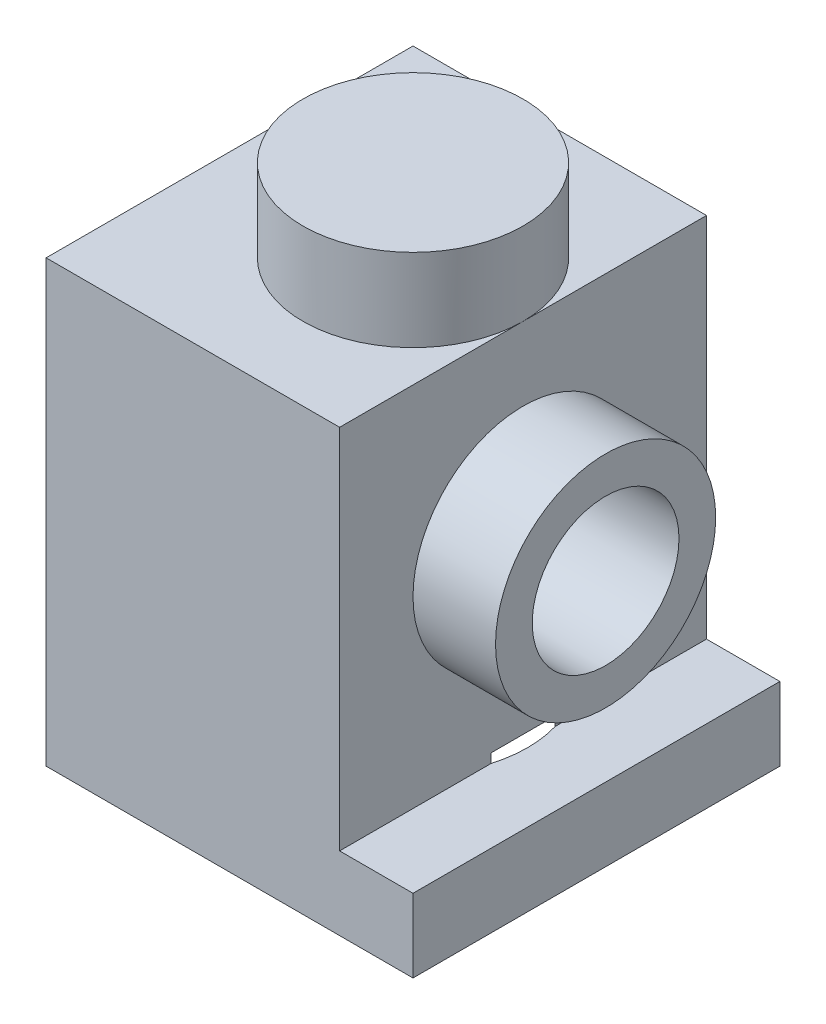
ISO-10303-21;
HEADER;
FILE_DESCRIPTION(('STEP AP214'),'2;1');
FILE_NAME('part.step','',(''),(''),'','','');
FILE_SCHEMA(('AUTOMOTIVE_DESIGN { 1 0 10303 214 1 1 1 1 }'));
ENDSEC;
DATA;
#1=APPLICATION_CONTEXT('core data for automotive mechanical design processes');
#2=APPLICATION_PROTOCOL_DEFINITION('international standard','automotive_design',2000,#1);
#3=PRODUCT_CONTEXT('',#1,'mechanical');
#4=PRODUCT('Part','Part','',(#3));
#5=PRODUCT_RELATED_PRODUCT_CATEGORY('part','',(#4));
#6=PRODUCT_DEFINITION_FORMATION('','',#4);
#7=PRODUCT_DEFINITION_CONTEXT('part definition',#1,'design');
#8=PRODUCT_DEFINITION('design','',#6,#7);
#9=PRODUCT_DEFINITION_SHAPE('','',#8);
#10=(LENGTH_UNIT() NAMED_UNIT(*) SI_UNIT(.MILLI.,.METRE.));
#11=(NAMED_UNIT(*) PLANE_ANGLE_UNIT() SI_UNIT($,.RADIAN.));
#12=(NAMED_UNIT(*) SI_UNIT($,.STERADIAN.) SOLID_ANGLE_UNIT());
#13=UNCERTAINTY_MEASURE_WITH_UNIT(LENGTH_MEASURE(1.E-05),#10,'distance_accuracy_value','');
#14=(GEOMETRIC_REPRESENTATION_CONTEXT(3) GLOBAL_UNCERTAINTY_ASSIGNED_CONTEXT((#13)) GLOBAL_UNIT_ASSIGNED_CONTEXT((#10,
#11,#12)) REPRESENTATION_CONTEXT('',''));
#15=CARTESIAN_POINT('',(0.,0.,0.));
#16=DIRECTION('',(0.,0.,1.));
#17=DIRECTION('',(1.,0.,0.));
#18=AXIS2_PLACEMENT_3D('',#15,#16,#17);
#19=CARTESIAN_POINT('',(-4.8,5.6,0.));
#20=DIRECTION('',(1.,0.,0.));
#21=DIRECTION('',(0.,0.,-1.));
#22=AXIS2_PLACEMENT_3D('',#19,#20,#21);
#23=CYLINDRICAL_SURFACE('',#22,1.6);
#24=CARTESIAN_POINT('',(4.2,5.6,0.));
#25=DIRECTION('',(1.,0.,0.));
#26=DIRECTION('',(0.,0.,-1.));
#27=AXIS2_PLACEMENT_3D('',#24,#25,#26);
#28=CIRCLE('',#27,1.6);
#29=CARTESIAN_POINT('',(4.2,5.6,-1.60000000000009));
#30=VERTEX_POINT('',#29);
#31=EDGE_CURVE('E176',#30,#30,#28,.T.);
#32=ORIENTED_EDGE('',*,*,#31,.T.);
#33=EDGE_LOOP('',(#32));
#34=FACE_BOUND('',#33,.T.);
#35=CARTESIAN_POINT('',(1.,5.6,0.));
#36=DIRECTION('',(-1.,0.,0.));
#37=DIRECTION('',(0.,0.,1.));
#38=AXIS2_PLACEMENT_3D('',#35,#36,#37);
#39=CIRCLE('',#38,1.6);
#40=CARTESIAN_POINT('',(1.,5.6,1.5999999999999));
#41=VERTEX_POINT('',#40);
#42=EDGE_CURVE('E167',#41,#41,#39,.F.);
#43=ORIENTED_EDGE('',*,*,#42,.F.);
#44=EDGE_LOOP('',(#43));
#45=FACE_BOUND('',#44,.T.);
#46=ADVANCED_FACE('F33',(#34,#45),#23,.F.);
#47=CARTESIAN_POINT('',(4.,9.6,4.));
#48=DIRECTION('',(-1.,0.,0.));
#49=DIRECTION('',(0.,0.,1.));
#50=AXIS2_PLACEMENT_3D('',#47,#48,#49);
#51=PLANE('',#50);
#52=DIRECTION('',(0.,0.,-1.));
#53=VECTOR('',#52,1.);
#54=CARTESIAN_POINT('',(4.,1.6,-4.));
#55=LINE('',#54,#53);
#56=CARTESIAN_POINT('',(4.,1.6,4.));
#57=VERTEX_POINT('',#56);
#58=CARTESIAN_POINT('',(4.,1.6,-4.));
#59=VERTEX_POINT('',#58);
#60=EDGE_CURVE('E190',#57,#59,#55,.T.);
#61=ORIENTED_EDGE('',*,*,#60,.F.);
#62=DIRECTION('',(0.,-1.,0.));
#63=VECTOR('',#62,1.);
#64=CARTESIAN_POINT('',(4.,9.6,4.));
#65=LINE('',#64,#63);
#66=CARTESIAN_POINT('',(4.,0.,4.));
#67=VERTEX_POINT('',#66);
#68=EDGE_CURVE('E226',#57,#67,#65,.T.);
#69=ORIENTED_EDGE('',*,*,#68,.T.);
#70=DIRECTION('',(0.,0.,-1.));
#71=VECTOR('',#70,1.);
#72=CARTESIAN_POINT('',(4.,0.,4.));
#73=LINE('',#72,#71);
#74=CARTESIAN_POINT('',(4.,0.,-4.));
#75=VERTEX_POINT('',#74);
#76=EDGE_CURVE('E218',#67,#75,#73,.T.);
#77=ORIENTED_EDGE('',*,*,#76,.T.);
#78=DIRECTION('',(0.,-1.,0.));
#79=VECTOR('',#78,1.);
#80=CARTESIAN_POINT('',(4.,9.6,-4.));
#81=LINE('',#80,#79);
#82=EDGE_CURVE('E224',#59,#75,#81,.T.);
#83=ORIENTED_EDGE('',*,*,#82,.F.);
#84=EDGE_LOOP('',(#61,#69,#77,#83));
#85=FACE_BOUND('',#84,.T.);
#86=ADVANCED_FACE('F240',(#85),#51,.F.);
#87=CARTESIAN_POINT('',(-4.,9.6,4.));
#88=DIRECTION('',(1.,0.,0.));
#89=DIRECTION('',(0.,0.,-1.));
#90=AXIS2_PLACEMENT_3D('',#87,#88,#89);
#91=PLANE('',#90);
#92=DIRECTION('',(0.,0.,1.));
#93=VECTOR('',#92,1.);
#94=CARTESIAN_POINT('',(-4.,3.19828034728268,2.39999999999981));
#95=LINE('',#94,#93);
#96=CARTESIAN_POINT('',(-4.,3.19828034728268,-2.4));
#97=VERTEX_POINT('',#96);
#98=CARTESIAN_POINT('',(-4.,3.19828034728268,2.39999999999981));
#99=VERTEX_POINT('',#98);
#100=EDGE_CURVE('E157',#97,#99,#95,.T.);
#101=ORIENTED_EDGE('',*,*,#100,.F.);
#102=DIRECTION('',(0.,-1.,0.));
#103=VECTOR('',#102,1.);
#104=CARTESIAN_POINT('',(-4.,3.19828034728268,-2.4));
#105=LINE('',#104,#103);
#106=CARTESIAN_POINT('',(-4.,8.00171965271731,-2.4));
#107=VERTEX_POINT('',#106);
#108=EDGE_CURVE('E56',#107,#97,#105,.T.);
#109=ORIENTED_EDGE('',*,*,#108,.F.);
#110=DIRECTION('',(0.,0.,-1.));
#111=VECTOR('',#110,1.);
#112=CARTESIAN_POINT('',(-4.,8.00171965271731,2.39999999999981));
#113=LINE('',#112,#111);
#114=CARTESIAN_POINT('',(-4.,8.00171965271731,2.39999999999981));
#115=VERTEX_POINT('',#114);
#116=EDGE_CURVE('E146',#115,#107,#113,.T.);
#117=ORIENTED_EDGE('',*,*,#116,.F.);
#118=DIRECTION('',(0.,1.,0.));
#119=VECTOR('',#118,1.);
#120=CARTESIAN_POINT('',(-4.,3.19828034728268,2.39999999999981));
#121=LINE('',#120,#119);
#122=EDGE_CURVE('E160',#99,#115,#121,.T.);
#123=ORIENTED_EDGE('',*,*,#122,.F.);
#124=EDGE_LOOP('',(#101,#109,#117,#123));
#125=FACE_BOUND('',#124,.T.);
#126=DIRECTION('',(0.,0.,1.));
#127=VECTOR('',#126,1.);
#128=CARTESIAN_POINT('',(-4.,0.,4.));
#129=LINE('',#128,#127);
#130=CARTESIAN_POINT('',(-4.,0.,-4.));
#131=VERTEX_POINT('',#130);
#132=CARTESIAN_POINT('',(-4.,0.,4.));
#133=VERTEX_POINT('',#132);
#134=EDGE_CURVE('E200',#131,#133,#129,.T.);
#135=ORIENTED_EDGE('',*,*,#134,.T.);
#136=DIRECTION('',(0.,-1.,0.));
#137=VECTOR('',#136,1.);
#138=CARTESIAN_POINT('',(-4.,9.6,4.));
#139=LINE('',#138,#137);
#140=CARTESIAN_POINT('',(-4.,9.6,4.));
#141=VERTEX_POINT('',#140);
#142=EDGE_CURVE('E228',#141,#133,#139,.T.);
#143=ORIENTED_EDGE('',*,*,#142,.F.);
#144=DIRECTION('',(0.,0.,1.));
#145=VECTOR('',#144,1.);
#146=CARTESIAN_POINT('',(-4.,9.6,4.));
#147=LINE('',#146,#145);
#148=CARTESIAN_POINT('',(-4.,9.6,-4.));
#149=VERTEX_POINT('',#148);
#150=EDGE_CURVE('E203',#149,#141,#147,.T.);
#151=ORIENTED_EDGE('',*,*,#150,.F.);
#152=DIRECTION('',(0.,-1.,0.));
#153=VECTOR('',#152,1.);
#154=CARTESIAN_POINT('',(-4.,9.6,-4.));
#155=LINE('',#154,#153);
#156=EDGE_CURVE('E212',#149,#131,#155,.T.);
#157=ORIENTED_EDGE('',*,*,#156,.T.);
#158=EDGE_LOOP('',(#135,#143,#151,#157));
#159=FACE_BOUND('',#158,.T.);
#160=ADVANCED_FACE('F35',(#125,#159),#91,.F.);
#161=CARTESIAN_POINT('',(4.,9.6,4.));
#162=DIRECTION('',(0.,0.,-1.));
#163=DIRECTION('',(-1.,0.,0.));
#164=AXIS2_PLACEMENT_3D('',#161,#162,#163);
#165=PLANE('',#164);
#166=DIRECTION('',(1.,0.,0.));
#167=VECTOR('',#166,1.);
#168=CARTESIAN_POINT('',(2.4,1.6,4.));
#169=LINE('',#168,#167);
#170=CARTESIAN_POINT('',(2.4,1.6,4.));
#171=VERTEX_POINT('',#170);
#172=EDGE_CURVE('E188',#171,#57,#169,.T.);
#173=ORIENTED_EDGE('',*,*,#172,.F.);
#174=DIRECTION('',(0.,1.,0.));
#175=VECTOR('',#174,1.);
#176=CARTESIAN_POINT('',(2.4,1.6,4.));
#177=LINE('',#176,#175);
#178=CARTESIAN_POINT('',(2.4,9.6,4.));
#179=VERTEX_POINT('',#178);
#180=EDGE_CURVE('E195',#171,#179,#177,.T.);
#181=ORIENTED_EDGE('',*,*,#180,.T.);
#182=DIRECTION('',(1.,0.,0.));
#183=VECTOR('',#182,1.);
#184=CARTESIAN_POINT('',(4.,9.6,4.));
#185=LINE('',#184,#183);
#186=EDGE_CURVE('E206',#141,#179,#185,.T.);
#187=ORIENTED_EDGE('',*,*,#186,.F.);
#188=ORIENTED_EDGE('',*,*,#142,.T.);
#189=DIRECTION('',(1.,0.,0.));
#190=VECTOR('',#189,1.);
#191=CARTESIAN_POINT('',(4.,0.,4.));
#192=LINE('',#191,#190);
#193=EDGE_CURVE('E215',#133,#67,#192,.T.);
#194=ORIENTED_EDGE('',*,*,#193,.T.);
#195=ORIENTED_EDGE('',*,*,#68,.F.);
#196=EDGE_LOOP('',(#173,#181,#187,#188,#194,#195));
#197=FACE_BOUND('',#196,.T.);
#198=ADVANCED_FACE('F277',(#197),#165,.F.);
#199=CARTESIAN_POINT('',(4.,9.6,-4.));
#200=DIRECTION('',(0.,0.,1.));
#201=DIRECTION('',(1.,0.,0.));
#202=AXIS2_PLACEMENT_3D('',#199,#200,#201);
#203=PLANE('',#202);
#204=DIRECTION('',(-1.,0.,0.));
#205=VECTOR('',#204,1.);
#206=CARTESIAN_POINT('',(4.,9.6,-4.));
#207=LINE('',#206,#205);
#208=CARTESIAN_POINT('',(2.4,9.6,-4.));
#209=VERTEX_POINT('',#208);
#210=EDGE_CURVE('E210',#209,#149,#207,.T.);
#211=ORIENTED_EDGE('',*,*,#210,.F.);
#212=DIRECTION('',(0.,1.,0.));
#213=VECTOR('',#212,1.);
#214=CARTESIAN_POINT('',(2.4,1.6,-4.));
#215=LINE('',#214,#213);
#216=CARTESIAN_POINT('',(2.4,1.6,-4.));
#217=VERTEX_POINT('',#216);
#218=EDGE_CURVE('E198',#217,#209,#215,.T.);
#219=ORIENTED_EDGE('',*,*,#218,.F.);
#220=DIRECTION('',(-1.,0.,0.));
#221=VECTOR('',#220,1.);
#222=CARTESIAN_POINT('',(2.4,1.6,-4.));
#223=LINE('',#222,#221);
#224=EDGE_CURVE('E192',#59,#217,#223,.T.);
#225=ORIENTED_EDGE('',*,*,#224,.F.);
#226=ORIENTED_EDGE('',*,*,#82,.T.);
#227=DIRECTION('',(-1.,0.,0.));
#228=VECTOR('',#227,1.);
#229=CARTESIAN_POINT('',(4.,0.,-4.));
#230=LINE('',#229,#228);
#231=EDGE_CURVE('E207',#75,#131,#230,.T.);
#232=ORIENTED_EDGE('',*,*,#231,.T.);
#233=ORIENTED_EDGE('',*,*,#156,.F.);
#234=EDGE_LOOP('',(#211,#219,#225,#226,#232,#233));
#235=FACE_BOUND('',#234,.T.);
#236=ADVANCED_FACE('F271',(#235),#203,.F.);
#237=CARTESIAN_POINT('',(0.,9.6,0.));
#238=DIRECTION('',(0.,1.,0.));
#239=DIRECTION('',(0.,0.,1.));
#240=AXIS2_PLACEMENT_3D('',#237,#238,#239);
#241=PLANE('',#240);
#242=DIRECTION('',(0.,0.,1.));
#243=VECTOR('',#242,1.);
#244=CARTESIAN_POINT('',(2.4,9.6,-4.));
#245=LINE('',#244,#243);
#246=CARTESIAN_POINT('',(2.4,9.6,0.));
#247=VERTEX_POINT('',#246);
#248=EDGE_CURVE('E185',#247,#179,#245,.T.);
#249=ORIENTED_EDGE('',*,*,#248,.F.);
#250=CARTESIAN_POINT('',(0.,9.6,0.));
#251=DIRECTION('',(0.,1.,0.));
#252=DIRECTION('',(0.,0.,1.));
#253=AXIS2_PLACEMENT_3D('',#250,#251,#252);
#254=CIRCLE('',#253,2.4);
#255=EDGE_CURVE('E177',#247,#247,#254,.T.);
#256=ORIENTED_EDGE('',*,*,#255,.F.);
#257=EDGE_CURVE('E196',#209,#247,#245,.T.);
#258=ORIENTED_EDGE('',*,*,#257,.F.);
#259=ORIENTED_EDGE('',*,*,#210,.T.);
#260=ORIENTED_EDGE('',*,*,#150,.T.);
#261=ORIENTED_EDGE('',*,*,#186,.T.);
#262=EDGE_LOOP('',(#249,#256,#258,#259,#260,#261));
#263=FACE_BOUND('',#262,.T.);
#264=ADVANCED_FACE('F268',(#263),#241,.T.);
#265=CARTESIAN_POINT('',(0.,0.,0.));
#266=DIRECTION('',(0.,1.,0.));
#267=DIRECTION('',(0.,0.,1.));
#268=AXIS2_PLACEMENT_3D('',#265,#266,#267);
#269=PLANE('',#268);
#270=CARTESIAN_POINT('',(0.,0.,0.));
#271=DIRECTION('',(0.,-1.,0.));
#272=DIRECTION('',(0.,0.,-1.));
#273=AXIS2_PLACEMENT_3D('',#270,#271,#272);
#274=CIRCLE('',#273,2.5);
#275=CARTESIAN_POINT('',(0.,0.,-2.5));
#276=VERTEX_POINT('',#275);
#277=EDGE_CURVE('E133',#276,#276,#274,.T.);
#278=ORIENTED_EDGE('',*,*,#277,.F.);
#279=EDGE_LOOP('',(#278));
#280=FACE_BOUND('',#279,.T.);
#281=ORIENTED_EDGE('',*,*,#134,.F.);
#282=ORIENTED_EDGE('',*,*,#231,.F.);
#283=ORIENTED_EDGE('',*,*,#76,.F.);
#284=ORIENTED_EDGE('',*,*,#193,.F.);
#285=EDGE_LOOP('',(#281,#282,#283,#284));
#286=FACE_BOUND('',#285,.T.);
#287=ADVANCED_FACE('F266',(#280,#286),#269,.F.);
#288=CARTESIAN_POINT('',(2.4,1.6,-4.));
#289=DIRECTION('',(-1.,0.,0.));
#290=DIRECTION('',(0.,0.,1.));
#291=AXIS2_PLACEMENT_3D('',#288,#289,#290);
#292=PLANE('',#291);
#293=CARTESIAN_POINT('',(2.4,5.6,0.));
#294=DIRECTION('',(-1.,0.,0.));
#295=DIRECTION('',(0.,0.,1.));
#296=AXIS2_PLACEMENT_3D('',#293,#294,#295);
#297=CIRCLE('',#296,2.4);
#298=CARTESIAN_POINT('',(2.4,5.6,2.3999999999999));
#299=VERTEX_POINT('',#298);
#300=EDGE_CURVE('E231',#299,#299,#297,.F.);
#301=ORIENTED_EDGE('',*,*,#300,.F.);
#302=EDGE_LOOP('',(#301));
#303=FACE_BOUND('',#302,.T.);
#304=DIRECTION('',(0.,0.,1.));
#305=VECTOR('',#304,1.);
#306=CARTESIAN_POINT('',(2.4,1.8,-4.));
#307=LINE('',#306,#305);
#308=CARTESIAN_POINT('',(2.4,1.8,-0.700000000000001));
#309=VERTEX_POINT('',#308);
#310=CARTESIAN_POINT('',(2.4,1.8,0.700000000000001));
#311=VERTEX_POINT('',#310);
#312=EDGE_CURVE('E11',#309,#311,#307,.T.);
#313=ORIENTED_EDGE('',*,*,#312,.F.);
#314=DIRECTION('',(0.,-1.,0.));
#315=VECTOR('',#314,1.);
#316=CARTESIAN_POINT('',(2.4,1.8,-0.700000000000001));
#317=LINE('',#316,#315);
#318=CARTESIAN_POINT('',(2.4,1.6,-0.700000000000001));
#319=VERTEX_POINT('',#318);
#320=EDGE_CURVE('E123',#309,#319,#317,.T.);
#321=ORIENTED_EDGE('',*,*,#320,.T.);
#322=DIRECTION('',(0.,0.,1.));
#323=VECTOR('',#322,1.);
#324=CARTESIAN_POINT('',(2.4,1.6,-4.));
#325=LINE('',#324,#323);
#326=EDGE_CURVE('E186',#217,#319,#325,.T.);
#327=ORIENTED_EDGE('',*,*,#326,.F.);
#328=ORIENTED_EDGE('',*,*,#218,.T.);
#329=ORIENTED_EDGE('',*,*,#257,.T.);
#330=ORIENTED_EDGE('',*,*,#248,.T.);
#331=ORIENTED_EDGE('',*,*,#180,.F.);
#332=CARTESIAN_POINT('',(2.4,1.6,0.700000000000001));
#333=VERTEX_POINT('',#332);
#334=EDGE_CURVE('E138',#333,#171,#325,.T.);
#335=ORIENTED_EDGE('',*,*,#334,.F.);
#336=DIRECTION('',(0.,-1.,0.));
#337=VECTOR('',#336,1.);
#338=CARTESIAN_POINT('',(2.4,1.8,0.700000000000001));
#339=LINE('',#338,#337);
#340=EDGE_CURVE('E48',#333,#311,#339,.F.);
#341=ORIENTED_EDGE('',*,*,#340,.T.);
#342=EDGE_LOOP('',(#313,#321,#327,#328,#329,#330,#331,#335,#341));
#343=FACE_BOUND('',#342,.T.);
#344=ADVANCED_FACE('F135',(#303,#343),#292,.F.);
#345=CARTESIAN_POINT('',(0.,1.6,0.));
#346=DIRECTION('',(0.,1.,0.));
#347=DIRECTION('',(0.,0.,1.));
#348=AXIS2_PLACEMENT_3D('',#345,#346,#347);
#349=PLANE('',#348);
#350=CARTESIAN_POINT('',(0.,1.6,0.));
#351=DIRECTION('',(0.,1.,0.));
#352=DIRECTION('',(0.,0.,1.));
#353=AXIS2_PLACEMENT_3D('',#350,#351,#352);
#354=CIRCLE('',#353,2.5);
#355=EDGE_CURVE('E41',#333,#319,#354,.T.);
#356=ORIENTED_EDGE('',*,*,#355,.F.);
#357=ORIENTED_EDGE('',*,*,#334,.T.);
#358=ORIENTED_EDGE('',*,*,#172,.T.);
#359=ORIENTED_EDGE('',*,*,#60,.T.);
#360=ORIENTED_EDGE('',*,*,#224,.T.);
#361=ORIENTED_EDGE('',*,*,#326,.T.);
#362=EDGE_LOOP('',(#356,#357,#358,#359,#360,#361));
#363=FACE_BOUND('',#362,.T.);
#364=ADVANCED_FACE('F259',(#363),#349,.T.);
#365=CARTESIAN_POINT('',(4.2,5.6,0.));
#366=DIRECTION('',(-1.,0.,0.));
#367=DIRECTION('',(0.,0.,1.));
#368=AXIS2_PLACEMENT_3D('',#365,#366,#367);
#369=CYLINDRICAL_SURFACE('',#368,2.4);
#370=CARTESIAN_POINT('',(4.2,5.6,0.));
#371=DIRECTION('',(1.,0.,0.));
#372=DIRECTION('',(0.,0.,-1.));
#373=AXIS2_PLACEMENT_3D('',#370,#371,#372);
#374=CIRCLE('',#373,2.4);
#375=CARTESIAN_POINT('',(4.2,5.6,-2.4000000000001));
#376=VERTEX_POINT('',#375);
#377=EDGE_CURVE('E182',#376,#376,#374,.T.);
#378=ORIENTED_EDGE('',*,*,#377,.F.);
#379=EDGE_LOOP('',(#378));
#380=FACE_BOUND('',#379,.T.);
#381=ORIENTED_EDGE('',*,*,#300,.T.);
#382=EDGE_LOOP('',(#381));
#383=FACE_BOUND('',#382,.T.);
#384=ADVANCED_FACE('F255',(#380,#383),#369,.T.);
#385=CARTESIAN_POINT('',(4.2,5.6,0.));
#386=DIRECTION('',(1.,0.,0.));
#387=DIRECTION('',(0.,0.,-1.));
#388=AXIS2_PLACEMENT_3D('',#385,#386,#387);
#389=PLANE('',#388);
#390=ORIENTED_EDGE('',*,*,#31,.F.);
#391=EDGE_LOOP('',(#390));
#392=FACE_BOUND('',#391,.T.);
#393=ORIENTED_EDGE('',*,*,#377,.T.);
#394=EDGE_LOOP('',(#393));
#395=FACE_BOUND('',#394,.T.);
#396=ADVANCED_FACE('F252',(#392,#395),#389,.T.);
#397=CARTESIAN_POINT('',(0.,11.4,0.));
#398=DIRECTION('',(0.,-1.,0.));
#399=DIRECTION('',(0.,0.,-1.));
#400=AXIS2_PLACEMENT_3D('',#397,#398,#399);
#401=CYLINDRICAL_SURFACE('',#400,2.4);
#402=CARTESIAN_POINT('',(0.,11.4,0.));
#403=DIRECTION('',(0.,1.,0.));
#404=DIRECTION('',(0.,0.,1.));
#405=AXIS2_PLACEMENT_3D('',#402,#403,#404);
#406=CIRCLE('',#405,2.4);
#407=CARTESIAN_POINT('',(0.,11.4,2.4));
#408=VERTEX_POINT('',#407);
#409=EDGE_CURVE('E173',#408,#408,#406,.T.);
#410=ORIENTED_EDGE('',*,*,#409,.F.);
#411=EDGE_LOOP('',(#410));
#412=FACE_BOUND('',#411,.T.);
#413=ORIENTED_EDGE('',*,*,#255,.T.);
#414=EDGE_LOOP('',(#413));
#415=FACE_BOUND('',#414,.T.);
#416=ADVANCED_FACE('F250',(#412,#415),#401,.T.);
#417=CARTESIAN_POINT('',(0.,11.4,0.));
#418=DIRECTION('',(0.,1.,0.));
#419=DIRECTION('',(0.,0.,1.));
#420=AXIS2_PLACEMENT_3D('',#417,#418,#419);
#421=PLANE('',#420);
#422=ORIENTED_EDGE('',*,*,#409,.T.);
#423=EDGE_LOOP('',(#422));
#424=FACE_BOUND('',#423,.T.);
#425=ADVANCED_FACE('F305',(#424),#421,.T.);
#426=CARTESIAN_POINT('',(1.,0.,0.));
#427=DIRECTION('',(-1.,0.,0.));
#428=DIRECTION('',(0.,0.,1.));
#429=AXIS2_PLACEMENT_3D('',#426,#427,#428);
#430=PLANE('',#429);
#431=DIRECTION('',(0.,-1.,0.));
#432=VECTOR('',#431,1.);
#433=CARTESIAN_POINT('',(1.,3.19828034728268,-2.4));
#434=LINE('',#433,#432);
#435=CARTESIAN_POINT('',(1.,8.00171965271731,-2.4));
#436=VERTEX_POINT('',#435);
#437=CARTESIAN_POINT('',(1.,3.19828034728268,-2.4));
#438=VERTEX_POINT('',#437);
#439=EDGE_CURVE('E142',#436,#438,#434,.T.);
#440=ORIENTED_EDGE('',*,*,#439,.T.);
#441=DIRECTION('',(0.,0.,1.));
#442=VECTOR('',#441,1.);
#443=CARTESIAN_POINT('',(1.,3.19828034728268,2.39999999999981));
#444=LINE('',#443,#442);
#445=CARTESIAN_POINT('',(1.,3.19828034728268,2.39999999999981));
#446=VERTEX_POINT('',#445);
#447=EDGE_CURVE('E145',#438,#446,#444,.T.);
#448=ORIENTED_EDGE('',*,*,#447,.T.);
#449=DIRECTION('',(0.,1.,0.));
#450=VECTOR('',#449,1.);
#451=CARTESIAN_POINT('',(1.,3.19828034728268,2.39999999999981));
#452=LINE('',#451,#450);
#453=CARTESIAN_POINT('',(1.,8.00171965271731,2.39999999999981));
#454=VERTEX_POINT('',#453);
#455=EDGE_CURVE('E149',#446,#454,#452,.T.);
#456=ORIENTED_EDGE('',*,*,#455,.T.);
#457=DIRECTION('',(0.,0.,-1.));
#458=VECTOR('',#457,1.);
#459=CARTESIAN_POINT('',(1.,8.00171965271731,2.39999999999981));
#460=LINE('',#459,#458);
#461=EDGE_CURVE('E152',#454,#436,#460,.T.);
#462=ORIENTED_EDGE('',*,*,#461,.T.);
#463=EDGE_LOOP('',(#440,#448,#456,#462));
#464=FACE_BOUND('',#463,.T.);
#465=ORIENTED_EDGE('',*,*,#42,.T.);
#466=EDGE_LOOP('',(#465));
#467=FACE_BOUND('',#466,.T.);
#468=ADVANCED_FACE('F237',(#464,#467),#430,.T.);
#469=CARTESIAN_POINT('',(1.,3.19828034728268,-2.4));
#470=DIRECTION('',(0.,0.,-1.));
#471=DIRECTION('',(-1.,0.,0.));
#472=AXIS2_PLACEMENT_3D('',#469,#470,#471);
#473=PLANE('',#472);
#474=ORIENTED_EDGE('',*,*,#108,.T.);
#475=DIRECTION('',(-1.,0.,0.));
#476=VECTOR('',#475,1.);
#477=CARTESIAN_POINT('',(1.,3.19828034728268,-2.4));
#478=LINE('',#477,#476);
#479=EDGE_CURVE('E155',#438,#97,#478,.T.);
#480=ORIENTED_EDGE('',*,*,#479,.F.);
#481=ORIENTED_EDGE('',*,*,#439,.F.);
#482=DIRECTION('',(-1.,0.,0.));
#483=VECTOR('',#482,1.);
#484=CARTESIAN_POINT('',(1.,8.00171965271731,-2.4));
#485=LINE('',#484,#483);
#486=EDGE_CURVE('E165',#436,#107,#485,.T.);
#487=ORIENTED_EDGE('',*,*,#486,.T.);
#488=EDGE_LOOP('',(#474,#480,#481,#487));
#489=FACE_BOUND('',#488,.T.);
#490=ADVANCED_FACE('F315',(#489),#473,.F.);
#491=CARTESIAN_POINT('',(1.,8.00171965271731,2.39999999999981));
#492=DIRECTION('',(0.,1.,0.));
#493=DIRECTION('',(0.,0.,1.));
#494=AXIS2_PLACEMENT_3D('',#491,#492,#493);
#495=PLANE('',#494);
#496=ORIENTED_EDGE('',*,*,#116,.T.);
#497=ORIENTED_EDGE('',*,*,#486,.F.);
#498=ORIENTED_EDGE('',*,*,#461,.F.);
#499=DIRECTION('',(-1.,0.,0.));
#500=VECTOR('',#499,1.);
#501=CARTESIAN_POINT('',(1.,8.00171965271731,2.39999999999981));
#502=LINE('',#501,#500);
#503=EDGE_CURVE('E168',#454,#115,#502,.T.);
#504=ORIENTED_EDGE('',*,*,#503,.T.);
#505=EDGE_LOOP('',(#496,#497,#498,#504));
#506=FACE_BOUND('',#505,.T.);
#507=ADVANCED_FACE('F321',(#506),#495,.F.);
#508=CARTESIAN_POINT('',(1.,3.19828034728268,2.39999999999981));
#509=DIRECTION('',(0.,0.,1.));
#510=DIRECTION('',(1.,0.,0.));
#511=AXIS2_PLACEMENT_3D('',#508,#509,#510);
#512=PLANE('',#511);
#513=ORIENTED_EDGE('',*,*,#122,.T.);
#514=ORIENTED_EDGE('',*,*,#503,.F.);
#515=ORIENTED_EDGE('',*,*,#455,.F.);
#516=DIRECTION('',(-1.,0.,0.));
#517=VECTOR('',#516,1.);
#518=CARTESIAN_POINT('',(1.,3.19828034728268,2.39999999999981));
#519=LINE('',#518,#517);
#520=EDGE_CURVE('E170',#446,#99,#519,.T.);
#521=ORIENTED_EDGE('',*,*,#520,.T.);
#522=EDGE_LOOP('',(#513,#514,#515,#521));
#523=FACE_BOUND('',#522,.T.);
#524=ADVANCED_FACE('F325',(#523),#512,.F.);
#525=CARTESIAN_POINT('',(1.,3.19828034728268,2.39999999999981));
#526=DIRECTION('',(0.,-1.,0.));
#527=DIRECTION('',(0.,0.,-1.));
#528=AXIS2_PLACEMENT_3D('',#525,#526,#527);
#529=PLANE('',#528);
#530=ORIENTED_EDGE('',*,*,#100,.T.);
#531=ORIENTED_EDGE('',*,*,#520,.F.);
#532=ORIENTED_EDGE('',*,*,#447,.F.);
#533=ORIENTED_EDGE('',*,*,#479,.T.);
#534=EDGE_LOOP('',(#530,#531,#532,#533));
#535=FACE_BOUND('',#534,.T.);
#536=ADVANCED_FACE('F322',(#535),#529,.F.);
#537=CARTESIAN_POINT('',(0.,1.8,0.));
#538=DIRECTION('',(0.,-1.,0.));
#539=DIRECTION('',(0.,0.,-1.));
#540=AXIS2_PLACEMENT_3D('',#537,#538,#539);
#541=PLANE('',#540);
#542=ORIENTED_EDGE('',*,*,#312,.T.);
#543=CARTESIAN_POINT('',(0.,1.8,0.));
#544=DIRECTION('',(0.,-1.,0.));
#545=DIRECTION('',(0.,0.,-1.));
#546=AXIS2_PLACEMENT_3D('',#543,#544,#545);
#547=CIRCLE('',#546,2.5);
#548=EDGE_CURVE('E126',#311,#309,#547,.T.);
#549=ORIENTED_EDGE('',*,*,#548,.T.);
#550=EDGE_LOOP('',(#542,#549));
#551=FACE_BOUND('',#550,.T.);
#552=ADVANCED_FACE('F132',(#551),#541,.T.);
#553=CARTESIAN_POINT('',(0.,1.8,0.));
#554=DIRECTION('',(0.,-1.,0.));
#555=DIRECTION('',(0.,0.,-1.));
#556=AXIS2_PLACEMENT_3D('',#553,#554,#555);
#557=CYLINDRICAL_SURFACE('',#556,2.5);
#558=ORIENTED_EDGE('',*,*,#277,.T.);
#559=EDGE_LOOP('',(#558));
#560=FACE_BOUND('',#559,.T.);
#561=ORIENTED_EDGE('',*,*,#548,.F.);
#562=ORIENTED_EDGE('',*,*,#340,.F.);
#563=ORIENTED_EDGE('',*,*,#355,.T.);
#564=ORIENTED_EDGE('',*,*,#320,.F.);
#565=EDGE_LOOP('',(#561,#562,#563,#564));
#566=FACE_BOUND('',#565,.T.);
#567=ADVANCED_FACE('F125',(#560,#566),#557,.F.);
#568=CLOSED_SHELL('',(#46,#86,#160,#198,#236,#264,#287,#344,#364,#384,#396,#416,#425,#468,#490,
#507,#524,#536,#552,#567));
#569=MANIFOLD_SOLID_BREP('B2',#568);
#570=ADVANCED_BREP_SHAPE_REPRESENTATION('',(#18,#569),#14);
#571=SHAPE_DEFINITION_REPRESENTATION(#9,#570);
ENDSEC;
END-ISO-10303-21;
